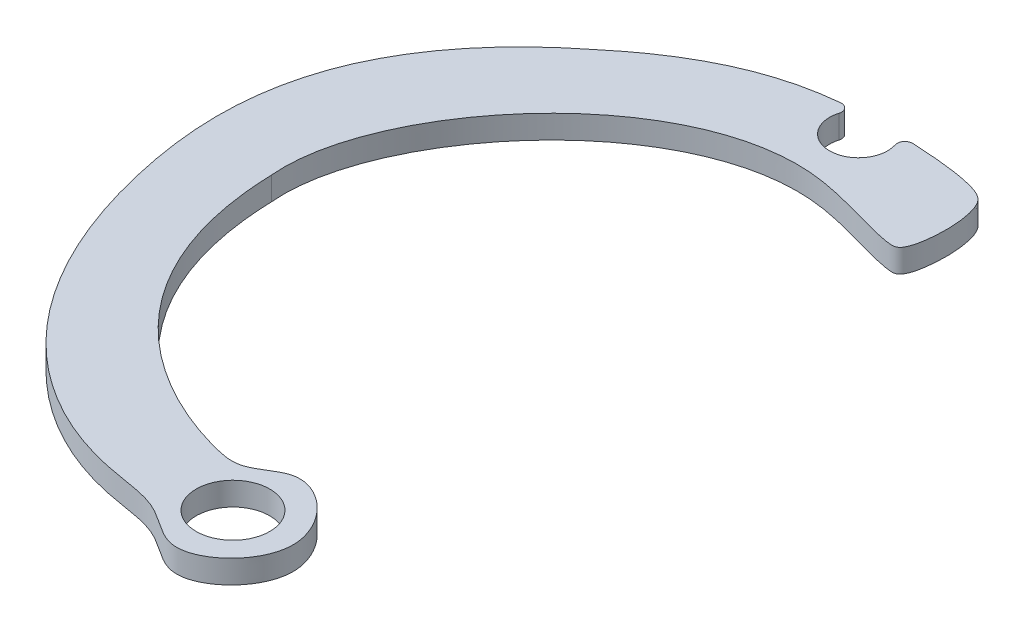
ISO-10303-21;
HEADER;
FILE_DESCRIPTION(('STEP AP214'),'2;1');
FILE_NAME('part.step','',(''),(''),'','','');
FILE_SCHEMA(('AUTOMOTIVE_DESIGN { 1 0 10303 214 1 1 1 1 }'));
ENDSEC;
DATA;
#1=APPLICATION_CONTEXT('core data for automotive mechanical design processes');
#2=APPLICATION_PROTOCOL_DEFINITION('international standard','automotive_design',2000,#1);
#3=PRODUCT_CONTEXT('',#1,'mechanical');
#4=PRODUCT('Part','Part','',(#3));
#5=PRODUCT_RELATED_PRODUCT_CATEGORY('part','',(#4));
#6=PRODUCT_DEFINITION_FORMATION('','',#4);
#7=PRODUCT_DEFINITION_CONTEXT('part definition',#1,'design');
#8=PRODUCT_DEFINITION('design','',#6,#7);
#9=PRODUCT_DEFINITION_SHAPE('','',#8);
#10=(LENGTH_UNIT() NAMED_UNIT(*) SI_UNIT(.MILLI.,.METRE.));
#11=(NAMED_UNIT(*) PLANE_ANGLE_UNIT() SI_UNIT($,.RADIAN.));
#12=(NAMED_UNIT(*) SI_UNIT($,.STERADIAN.) SOLID_ANGLE_UNIT());
#13=UNCERTAINTY_MEASURE_WITH_UNIT(LENGTH_MEASURE(1.E-05),#10,'distance_accuracy_value','');
#14=(GEOMETRIC_REPRESENTATION_CONTEXT(3) GLOBAL_UNCERTAINTY_ASSIGNED_CONTEXT((#13)) GLOBAL_UNIT_ASSIGNED_CONTEXT((#10,
#11,#12)) REPRESENTATION_CONTEXT('',''));
#15=CARTESIAN_POINT('',(0.,0.,0.));
#16=DIRECTION('',(0.,0.,1.));
#17=DIRECTION('',(1.,0.,0.));
#18=AXIS2_PLACEMENT_3D('',#15,#16,#17);
#19=CARTESIAN_POINT('',(-35.,3.,0.));
#20=CARTESIAN_POINT('',(-36.3595163255424,3.,-14.8310723247841));
#21=CARTESIAN_POINT('',(-14.1840571627821,3.,-42.3616456408785));
#22=CARTESIAN_POINT('',(10.1237636745998,3.,-32.2602385637537));
#23=CARTESIAN_POINT('',(14.7097691214885,3.,-32.0642952487715));
#24=CARTESIAN_POINT('',(15.1739043129241,3.,-40.8182400149328));
#25=CARTESIAN_POINT('',(12.2733614165845,3.,-44.162560977449));
#26=CARTESIAN_POINT('',(0.297772142968115,3.,-45.5563098976306));
#27=CARTESIAN_POINT('',(-16.5395725121755,3.,-44.6200481139064));
#28=CARTESIAN_POINT('',(-28.0000000000001,3.,-34.9999999999999));
#29=B_SPLINE_CURVE_WITH_KNOTS('',3,(#19,#20,#21,#22,#23,#24,#25,#26,#27,#28),.UNSPECIFIED.,.F.,
.F.,(4,1,1,1,1,1,1,4),(0.,0.643737264429568,0.8044974616293,0.830880645771481,0.899048165842503,
0.911986837247498,0.951746419812553,1.),.UNSPECIFIED.);
#30=DIRECTION('',(0.,-1.,0.));
#31=VECTOR('',#30,1.);
#32=SURFACE_OF_LINEAR_EXTRUSION('',#29,#31);
#33=CARTESIAN_POINT('',(-35.,0.,0.));
#34=CARTESIAN_POINT('',(-36.3595163255424,0.,-14.8310723247841));
#35=CARTESIAN_POINT('',(-14.1840571627821,0.,-42.3616456408785));
#36=CARTESIAN_POINT('',(10.1237636745998,0.,-32.2602385637537));
#37=CARTESIAN_POINT('',(14.7097691214885,0.,-32.0642952487715));
#38=CARTESIAN_POINT('',(15.1739043129241,0.,-40.8182400149328));
#39=CARTESIAN_POINT('',(12.2733614165845,0.,-44.162560977449));
#40=CARTESIAN_POINT('',(0.297772142968115,0.,-45.5563098976306));
#41=CARTESIAN_POINT('',(-16.5395725121755,0.,-44.6200481139064));
#42=CARTESIAN_POINT('',(-28.0000000000001,0.,-34.9999999999999));
#43=B_SPLINE_CURVE_WITH_KNOTS('',3,(#33,#34,#35,#36,#37,#38,#39,#40,#41,#42),.UNSPECIFIED.,.F.,
.F.,(4,1,1,1,1,1,1,4),(0.,0.643737264429568,0.8044974616293,0.830880645771481,0.899048165842503,
0.911986837247498,0.951746419812553,1.),.UNSPECIFIED.);
#44=CARTESIAN_POINT('',(-35.,0.,0.));
#45=VERTEX_POINT('',#44);
#46=CARTESIAN_POINT('',(2.89437051443971,0.,-44.9086121727601));
#47=VERTEX_POINT('',#46);
#48=EDGE_CURVE('E106',#45,#47,#43,.T.);
#49=ORIENTED_EDGE('',*,*,#48,.T.);
#50=DIRECTION('',(0.,-1.,0.));
#51=VECTOR('',#50,1.);
#52=CARTESIAN_POINT('',(2.89437051443971,0.,-44.9086121727601));
#53=LINE('',#52,#51);
#54=CARTESIAN_POINT('',(2.89437051443971,3.,-44.9086121727601));
#55=VERTEX_POINT('',#54);
#56=EDGE_CURVE('E94',#47,#55,#53,.F.);
#57=ORIENTED_EDGE('',*,*,#56,.T.);
#58=CARTESIAN_POINT('',(-35.,3.,0.));
#59=VERTEX_POINT('',#58);
#60=EDGE_CURVE('E87',#59,#55,#29,.T.);
#61=ORIENTED_EDGE('',*,*,#60,.F.);
#62=DIRECTION('',(0.,-1.,0.));
#63=VECTOR('',#62,1.);
#64=CARTESIAN_POINT('',(-35.,3.,0.));
#65=LINE('',#64,#63);
#66=EDGE_CURVE('E91',#59,#45,#65,.T.);
#67=ORIENTED_EDGE('',*,*,#66,.T.);
#68=EDGE_LOOP('',(#49,#57,#61,#67));
#69=FACE_BOUND('',#68,.T.);
#70=ADVANCED_FACE('F33',(#69),#32,.F.);
#71=CARTESIAN_POINT('',(-28.,3.,-35.));
#72=CARTESIAN_POINT('',(-46.3291085570176,3.,-20.6391623268501));
#73=CARTESIAN_POINT('',(-47.0762208184843,3.,19.7034644950118));
#74=CARTESIAN_POINT('',(-25.747036948613,3.,42.3473226786794));
#75=CARTESIAN_POINT('',(-5.08845166615551,3.,44.1690400264804));
#76=CARTESIAN_POINT('',(0.849917634782803,3.,50.4800061677743));
#77=CARTESIAN_POINT('',(12.1162210226957,3.,40.168721850746));
#78=CARTESIAN_POINT('',(1.25058401142966,3.,29.3596285899384));
#79=CARTESIAN_POINT('',(-3.76924457275543,3.,34.9709529528692));
#80=CARTESIAN_POINT('',(-12.9261786717996,3.,33.4618380091895));
#81=CARTESIAN_POINT('',(-34.2949664997161,3.,24.3958753852306));
#82=CARTESIAN_POINT('',(-35.,3.,-6.67145561234987E-13));
#83=B_SPLINE_CURVE_WITH_KNOTS('',3,(#71,#72,#73,#74,#75,#76,#77,#78,#79,#80,#81,#82),
.UNSPECIFIED.,.F.,.F.,(4,1,1,1,1,1,1,1,1,4),(0.,0.209603548758597,0.538531046245612,
0.585123302502874,0.634410174145344,0.71979118309238,0.805172192039417,0.847140401278699,
0.866623182074757,1.),.UNSPECIFIED.);
#84=DIRECTION('',(0.,-1.,0.));
#85=VECTOR('',#84,1.);
#86=SURFACE_OF_LINEAR_EXTRUSION('',#83,#85);
#87=CARTESIAN_POINT('',(-28.,0.,-35.));
#88=CARTESIAN_POINT('',(-46.3291085570176,0.,-20.6391623268501));
#89=CARTESIAN_POINT('',(-47.0762208184843,0.,19.7034644950118));
#90=CARTESIAN_POINT('',(-25.747036948613,0.,42.3473226786794));
#91=CARTESIAN_POINT('',(-5.08845166615551,0.,44.1690400264804));
#92=CARTESIAN_POINT('',(0.849917634782803,0.,50.4800061677743));
#93=CARTESIAN_POINT('',(12.1162210226957,0.,40.168721850746));
#94=CARTESIAN_POINT('',(1.25058401142966,0.,29.3596285899384));
#95=CARTESIAN_POINT('',(-3.76924457275543,0.,34.9709529528692));
#96=CARTESIAN_POINT('',(-12.9261786717996,0.,33.4618380091895));
#97=CARTESIAN_POINT('',(-34.2949664997161,0.,24.3958753852306));
#98=CARTESIAN_POINT('',(-35.,0.,-6.67145561234987E-13));
#99=B_SPLINE_CURVE_WITH_KNOTS('',3,(#87,#88,#89,#90,#91,#92,#93,#94,#95,#96,#97,#98),
.UNSPECIFIED.,.F.,.F.,(4,1,1,1,1,1,1,1,1,4),(0.,0.209603548758597,0.538531046245612,
0.585123302502874,0.634410174145344,0.71979118309238,0.805172192039417,0.847140401278699,
0.866623182074757,1.),.UNSPECIFIED.);
#100=CARTESIAN_POINT('',(-28.0000000000001,0.,-34.9999999999999));
#101=VERTEX_POINT('',#100);
#102=EDGE_CURVE('E110',#101,#45,#99,.T.);
#103=ORIENTED_EDGE('',*,*,#102,.T.);
#104=ORIENTED_EDGE('',*,*,#66,.F.);
#105=CARTESIAN_POINT('',(-28.0000000000001,3.,-34.9999999999999));
#106=VERTEX_POINT('',#105);
#107=EDGE_CURVE('E100',#106,#59,#83,.T.);
#108=ORIENTED_EDGE('',*,*,#107,.F.);
#109=DIRECTION('',(0.,-1.,0.));
#110=VECTOR('',#109,1.);
#111=CARTESIAN_POINT('',(-28.0000000000001,3.,-34.9999999999999));
#112=LINE('',#111,#110);
#113=EDGE_CURVE('E96',#106,#101,#112,.T.);
#114=ORIENTED_EDGE('',*,*,#113,.T.);
#115=EDGE_LOOP('',(#103,#104,#108,#114));
#116=FACE_BOUND('',#115,.T.);
#117=ADVANCED_FACE('F108',(#116),#86,.F.);
#118=CARTESIAN_POINT('',(-6.32530738735835,3.,-44.8021624897013));
#119=VERTEX_POINT('',#118);
#120=EDGE_CURVE('E97',#119,#106,#29,.T.);
#121=ORIENTED_EDGE('',*,*,#120,.F.);
#122=DIRECTION('',(0.,-1.,0.));
#123=VECTOR('',#122,1.);
#124=CARTESIAN_POINT('',(-6.32530738735835,3.,-44.8021624897013));
#125=LINE('',#124,#123);
#126=CARTESIAN_POINT('',(-6.32530738735835,0.,-44.8021624897013));
#127=VERTEX_POINT('',#126);
#128=EDGE_CURVE('E11',#119,#127,#125,.T.);
#129=ORIENTED_EDGE('',*,*,#128,.T.);
#130=EDGE_CURVE('E131',#127,#101,#43,.T.);
#131=ORIENTED_EDGE('',*,*,#130,.T.);
#132=ORIENTED_EDGE('',*,*,#113,.F.);
#133=EDGE_LOOP('',(#121,#129,#131,#132));
#134=FACE_BOUND('',#133,.T.);
#135=ADVANCED_FACE('F159',(#134),#32,.F.);
#136=CARTESIAN_POINT('',(-17.2421940091148,3.,41.9660231526491));
#137=DIRECTION('',(0.,-1.,0.));
#138=DIRECTION('',(0.,0.,-1.));
#139=AXIS2_PLACEMENT_3D('',#136,#137,#138);
#140=PLANE('',#139);
#141=CARTESIAN_POINT('',(0.,3.,40.));
#142=DIRECTION('',(0.,1.,0.));
#143=DIRECTION('',(0.,0.,1.));
#144=AXIS2_PLACEMENT_3D('',#141,#142,#143);
#145=CIRCLE('',#144,4.75);
#146=CARTESIAN_POINT('',(0.,3.,44.75));
#147=VERTEX_POINT('',#146);
#148=EDGE_CURVE('E139',#147,#147,#145,.T.);
#149=ORIENTED_EDGE('',*,*,#148,.F.);
#150=EDGE_LOOP('',(#149));
#151=FACE_BOUND('',#150,.T.);
#152=ORIENTED_EDGE('',*,*,#60,.T.);
#153=CARTESIAN_POINT('',(2.84832767028414,3.,-43.9096727068754));
#154=DIRECTION('',(0.,-1.,0.));
#155=DIRECTION('',(0.,0.,-1.));
#156=AXIS2_PLACEMENT_3D('',#153,#154,#155);
#157=CIRCLE('',#156,1.);
#158=CARTESIAN_POINT('',(1.89638789990846,3.,-43.6033874255165));
#159=VERTEX_POINT('',#158);
#160=EDGE_CURVE('E120',#55,#159,#157,.F.);
#161=ORIENTED_EDGE('',*,*,#160,.T.);
#162=CARTESIAN_POINT('',(-1.67338623900036,3.,-42.4548176204207));
#163=DIRECTION('',(0.,1.,0.));
#164=DIRECTION('',(0.,0.,1.));
#165=AXIS2_PLACEMENT_3D('',#162,#163,#164);
#166=CIRCLE('',#165,3.75);
#167=CARTESIAN_POINT('',(-5.26822722902084,3.,-43.522346662868));
#168=VERTEX_POINT('',#167);
#169=EDGE_CURVE('E135',#168,#159,#166,.T.);
#170=ORIENTED_EDGE('',*,*,#169,.F.);
#171=CARTESIAN_POINT('',(-6.22685149302631,3.,-43.8070210741873));
#172=DIRECTION('',(0.,-1.,0.));
#173=DIRECTION('',(0.,0.,-1.));
#174=AXIS2_PLACEMENT_3D('',#171,#172,#173);
#175=CIRCLE('',#174,1.);
#176=EDGE_CURVE('E118',#168,#119,#175,.F.);
#177=ORIENTED_EDGE('',*,*,#176,.T.);
#178=ORIENTED_EDGE('',*,*,#120,.T.);
#179=ORIENTED_EDGE('',*,*,#107,.T.);
#180=EDGE_LOOP('',(#152,#161,#170,#177,#178,#179));
#181=FACE_BOUND('',#180,.T.);
#182=ADVANCED_FACE('F101',(#151,#181),#140,.F.);
#183=CARTESIAN_POINT('',(-17.2421940091148,0.,41.9660231526491));
#184=DIRECTION('',(0.,-1.,0.));
#185=DIRECTION('',(0.,0.,-1.));
#186=AXIS2_PLACEMENT_3D('',#183,#184,#185);
#187=PLANE('',#186);
#188=CARTESIAN_POINT('',(-1.67338623900036,0.,-42.4548176204207));
#189=DIRECTION('',(0.,-1.,0.));
#190=DIRECTION('',(0.,0.,-1.));
#191=AXIS2_PLACEMENT_3D('',#188,#189,#190);
#192=CIRCLE('',#191,3.75);
#193=CARTESIAN_POINT('',(1.89638789990846,0.,-43.6033874255165));
#194=VERTEX_POINT('',#193);
#195=CARTESIAN_POINT('',(-5.26822722902084,0.,-43.522346662868));
#196=VERTEX_POINT('',#195);
#197=EDGE_CURVE('E111',#194,#196,#192,.T.);
#198=ORIENTED_EDGE('',*,*,#197,.F.);
#199=CARTESIAN_POINT('',(2.84832767028414,0.,-43.9096727068754));
#200=DIRECTION('',(0.,-1.,0.));
#201=DIRECTION('',(0.,0.,-1.));
#202=AXIS2_PLACEMENT_3D('',#199,#200,#201);
#203=CIRCLE('',#202,1.);
#204=EDGE_CURVE('E41',#194,#47,#203,.T.);
#205=ORIENTED_EDGE('',*,*,#204,.T.);
#206=ORIENTED_EDGE('',*,*,#48,.F.);
#207=ORIENTED_EDGE('',*,*,#102,.F.);
#208=ORIENTED_EDGE('',*,*,#130,.F.);
#209=CARTESIAN_POINT('',(-6.22685149302631,0.,-43.8070210741873));
#210=DIRECTION('',(0.,-1.,0.));
#211=DIRECTION('',(0.,0.,-1.));
#212=AXIS2_PLACEMENT_3D('',#209,#210,#211);
#213=CIRCLE('',#212,1.);
#214=EDGE_CURVE('E48',#127,#196,#213,.T.);
#215=ORIENTED_EDGE('',*,*,#214,.T.);
#216=EDGE_LOOP('',(#198,#205,#206,#207,#208,#215));
#217=FACE_BOUND('',#216,.T.);
#218=CARTESIAN_POINT('',(0.,0.,40.));
#219=DIRECTION('',(0.,1.,0.));
#220=DIRECTION('',(0.,0.,1.));
#221=AXIS2_PLACEMENT_3D('',#218,#219,#220);
#222=CIRCLE('',#221,4.75);
#223=CARTESIAN_POINT('',(0.,0.,44.75));
#224=VERTEX_POINT('',#223);
#225=EDGE_CURVE('E142',#224,#224,#222,.T.);
#226=ORIENTED_EDGE('',*,*,#225,.T.);
#227=EDGE_LOOP('',(#226));
#228=FACE_BOUND('',#227,.T.);
#229=ADVANCED_FACE('F127',(#217,#228),#187,.T.);
#230=CARTESIAN_POINT('',(0.,0.,40.));
#231=DIRECTION('',(0.,1.,0.));
#232=DIRECTION('',(0.,0.,1.));
#233=AXIS2_PLACEMENT_3D('',#230,#231,#232);
#234=CYLINDRICAL_SURFACE('',#233,4.75);
#235=ORIENTED_EDGE('',*,*,#225,.F.);
#236=EDGE_LOOP('',(#235));
#237=FACE_BOUND('',#236,.T.);
#238=ORIENTED_EDGE('',*,*,#148,.T.);
#239=EDGE_LOOP('',(#238));
#240=FACE_BOUND('',#239,.T.);
#241=ADVANCED_FACE('F166',(#237,#240),#234,.F.);
#242=CARTESIAN_POINT('',(-1.67338623900036,-3.,-42.4548176204207));
#243=DIRECTION('',(0.,1.,0.));
#244=DIRECTION('',(0.,0.,1.));
#245=AXIS2_PLACEMENT_3D('',#242,#243,#244);
#246=CYLINDRICAL_SURFACE('',#245,3.75);
#247=ORIENTED_EDGE('',*,*,#169,.T.);
#248=DIRECTION('',(0.,1.,0.));
#249=VECTOR('',#248,1.);
#250=CARTESIAN_POINT('',(1.89638789990846,-3.,-43.6033874255165));
#251=LINE('',#250,#249);
#252=EDGE_CURVE('E124',#159,#194,#251,.F.);
#253=ORIENTED_EDGE('',*,*,#252,.T.);
#254=ORIENTED_EDGE('',*,*,#197,.T.);
#255=DIRECTION('',(0.,1.,0.));
#256=VECTOR('',#255,1.);
#257=CARTESIAN_POINT('',(-5.26822722902084,-3.,-43.522346662868));
#258=LINE('',#257,#256);
#259=EDGE_CURVE('E122',#196,#168,#258,.T.);
#260=ORIENTED_EDGE('',*,*,#259,.T.);
#261=EDGE_LOOP('',(#247,#253,#254,#260));
#262=FACE_BOUND('',#261,.T.);
#263=ADVANCED_FACE('F138',(#262),#246,.F.);
#264=CARTESIAN_POINT('',(2.84832767028414,1.5,-43.9096727068754));
#265=DIRECTION('',(0.,-1.,0.));
#266=DIRECTION('',(0.,0.,-1.));
#267=AXIS2_PLACEMENT_3D('',#264,#265,#266);
#268=CYLINDRICAL_SURFACE('',#267,1.);
#269=ORIENTED_EDGE('',*,*,#204,.F.);
#270=ORIENTED_EDGE('',*,*,#252,.F.);
#271=ORIENTED_EDGE('',*,*,#160,.F.);
#272=ORIENTED_EDGE('',*,*,#56,.F.);
#273=EDGE_LOOP('',(#269,#270,#271,#272));
#274=FACE_BOUND('',#273,.T.);
#275=ADVANCED_FACE('F132',(#274),#268,.T.);
#276=CARTESIAN_POINT('',(-6.22685149302631,1.5,-43.8070210741873));
#277=DIRECTION('',(0.,-1.,0.));
#278=DIRECTION('',(0.,0.,-1.));
#279=AXIS2_PLACEMENT_3D('',#276,#277,#278);
#280=CYLINDRICAL_SURFACE('',#279,1.);
#281=ORIENTED_EDGE('',*,*,#176,.F.);
#282=ORIENTED_EDGE('',*,*,#259,.F.);
#283=ORIENTED_EDGE('',*,*,#214,.F.);
#284=ORIENTED_EDGE('',*,*,#128,.F.);
#285=EDGE_LOOP('',(#281,#282,#283,#284));
#286=FACE_BOUND('',#285,.T.);
#287=ADVANCED_FACE('F35',(#286),#280,.T.);
#288=CLOSED_SHELL('',(#70,#117,#135,#182,#229,#241,#263,#275,#287));
#289=MANIFOLD_SOLID_BREP('B2',#288);
#290=ADVANCED_BREP_SHAPE_REPRESENTATION('',(#18,#289),#14);
#291=SHAPE_DEFINITION_REPRESENTATION(#9,#290);
ENDSEC;
END-ISO-10303-21;
